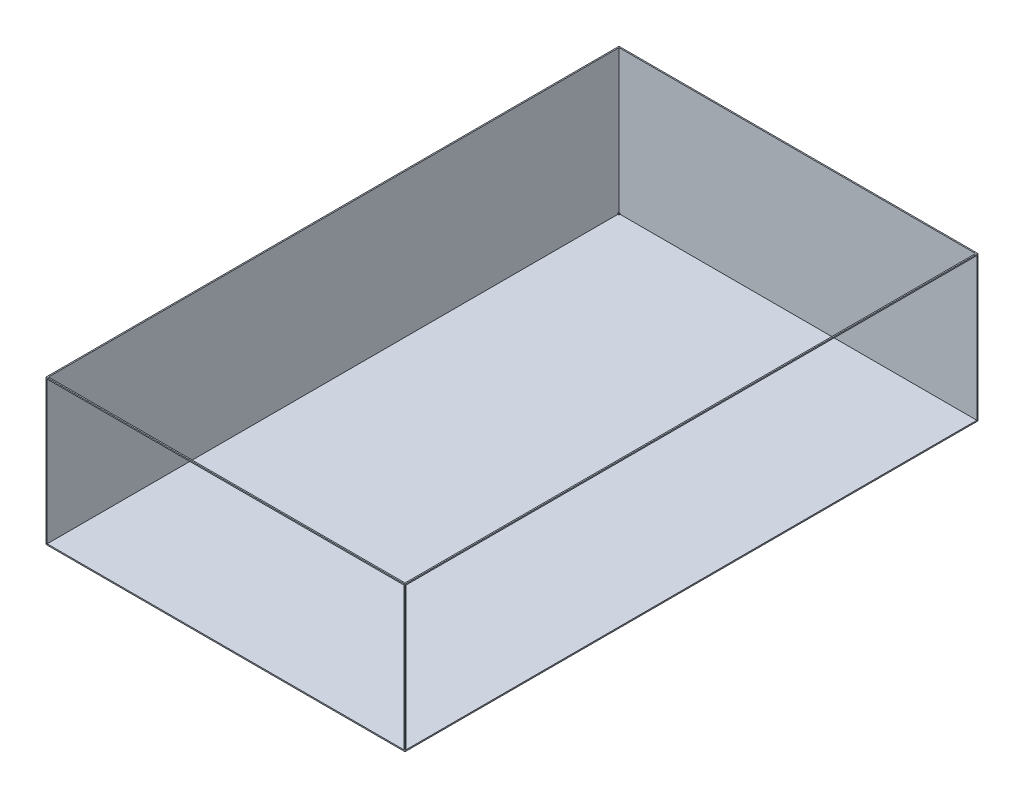
ISO-10303-21;
HEADER;
FILE_DESCRIPTION(('STEP AP214'),'2;1');
FILE_NAME('part.step','',(''),(''),'','','');
FILE_SCHEMA(('AUTOMOTIVE_DESIGN { 1 0 10303 214 1 1 1 1 }'));
ENDSEC;
DATA;
#1=APPLICATION_CONTEXT('core data for automotive mechanical design processes');
#2=APPLICATION_PROTOCOL_DEFINITION('international standard','automotive_design',2000,#1);
#3=PRODUCT_CONTEXT('',#1,'mechanical');
#4=PRODUCT('Part','Part','',(#3));
#5=PRODUCT_RELATED_PRODUCT_CATEGORY('part','',(#4));
#6=PRODUCT_DEFINITION_FORMATION('','',#4);
#7=PRODUCT_DEFINITION_CONTEXT('part definition',#1,'design');
#8=PRODUCT_DEFINITION('design','',#6,#7);
#9=PRODUCT_DEFINITION_SHAPE('','',#8);
#10=(LENGTH_UNIT() NAMED_UNIT(*) SI_UNIT(.MILLI.,.METRE.));
#11=(NAMED_UNIT(*) PLANE_ANGLE_UNIT() SI_UNIT($,.RADIAN.));
#12=(NAMED_UNIT(*) SI_UNIT($,.STERADIAN.) SOLID_ANGLE_UNIT());
#13=UNCERTAINTY_MEASURE_WITH_UNIT(LENGTH_MEASURE(1.E-05),#10,'distance_accuracy_value','');
#14=(GEOMETRIC_REPRESENTATION_CONTEXT(3) GLOBAL_UNCERTAINTY_ASSIGNED_CONTEXT((#13)) GLOBAL_UNIT_ASSIGNED_CONTEXT((#10,
#11,#12)) REPRESENTATION_CONTEXT('',''));
#15=CARTESIAN_POINT('',(0.,0.,0.));
#16=DIRECTION('',(0.,0.,1.));
#17=DIRECTION('',(1.,0.,0.));
#18=AXIS2_PLACEMENT_3D('',#15,#16,#17);
#19=CARTESIAN_POINT('',(0.,0.,-120.));
#20=DIRECTION('',(0.,0.,1.));
#21=DIRECTION('',(1.,0.,0.));
#22=AXIS2_PLACEMENT_3D('',#19,#20,#21);
#23=PLANE('',#22);
#24=DIRECTION('',(1.,0.,0.));
#25=VECTOR('',#24,1.);
#26=CARTESIAN_POINT('',(0.,0.249999999999997,-120.));
#27=LINE('',#26,#25);
#28=CARTESIAN_POINT('',(0.24999999999999,0.249999999999997,-120.));
#29=VERTEX_POINT('',#28);
#30=CARTESIAN_POINT('',(0.499999999999987,0.25,-120.));
#31=VERTEX_POINT('',#30);
#32=EDGE_CURVE('E207',#29,#31,#27,.T.);
#33=ORIENTED_EDGE('',*,*,#32,.T.);
#34=DIRECTION('',(0.,1.,0.));
#35=VECTOR('',#34,1.);
#36=CARTESIAN_POINT('',(0.499999999999987,0.,-120.));
#37=LINE('',#36,#35);
#38=CARTESIAN_POINT('',(0.499999999999987,0.5,-120.));
#39=VERTEX_POINT('',#38);
#40=EDGE_CURVE('E147',#31,#39,#37,.T.);
#41=ORIENTED_EDGE('',*,*,#40,.T.);
#42=DIRECTION('',(-1.,0.,0.));
#43=VECTOR('',#42,1.);
#44=CARTESIAN_POINT('',(0.,0.5,-120.));
#45=LINE('',#44,#43);
#46=CARTESIAN_POINT('',(0.24999999999999,0.5,-120.));
#47=VERTEX_POINT('',#46);
#48=EDGE_CURVE('E255',#39,#47,#45,.T.);
#49=ORIENTED_EDGE('',*,*,#48,.T.);
#50=DIRECTION('',(0.,-1.,0.));
#51=VECTOR('',#50,1.);
#52=CARTESIAN_POINT('',(0.24999999999999,0.,-120.));
#53=LINE('',#52,#51);
#54=EDGE_CURVE('E205',#47,#29,#53,.T.);
#55=ORIENTED_EDGE('',*,*,#54,.T.);
#56=EDGE_LOOP('',(#33,#41,#49,#55));
#57=FACE_BOUND('',#56,.T.);
#58=ADVANCED_FACE('F36',(#57),#23,.T.);
#59=CARTESIAN_POINT('',(75.5,30.5,-120.5));
#60=DIRECTION('',(1.,0.,0.));
#61=DIRECTION('',(0.,1.,0.));
#62=AXIS2_PLACEMENT_3D('',#59,#60,#61);
#63=PLANE('',#62);
#64=DIRECTION('',(0.,1.,0.));
#65=VECTOR('',#64,1.);
#66=CARTESIAN_POINT('',(75.5,30.5,0.));
#67=LINE('',#66,#65);
#68=CARTESIAN_POINT('',(75.5,0.,0.));
#69=VERTEX_POINT('',#68);
#70=CARTESIAN_POINT('',(75.5,30.5,0.));
#71=VERTEX_POINT('',#70);
#72=EDGE_CURVE('E248',#69,#71,#67,.T.);
#73=ORIENTED_EDGE('',*,*,#72,.F.);
#74=DIRECTION('',(0.,0.,1.));
#75=VECTOR('',#74,1.);
#76=CARTESIAN_POINT('',(75.5,0.,-120.5));
#77=LINE('',#76,#75);
#78=CARTESIAN_POINT('',(75.5,0.,-120.5));
#79=VERTEX_POINT('',#78);
#80=EDGE_CURVE('E258',#79,#69,#77,.T.);
#81=ORIENTED_EDGE('',*,*,#80,.F.);
#82=DIRECTION('',(0.,1.,0.));
#83=VECTOR('',#82,1.);
#84=CARTESIAN_POINT('',(75.5,30.5,-120.5));
#85=LINE('',#84,#83);
#86=CARTESIAN_POINT('',(75.5,30.5,-120.5));
#87=VERTEX_POINT('',#86);
#88=EDGE_CURVE('E236',#79,#87,#85,.T.);
#89=ORIENTED_EDGE('',*,*,#88,.T.);
#90=DIRECTION('',(0.,0.,1.));
#91=VECTOR('',#90,1.);
#92=CARTESIAN_POINT('',(75.5,30.5,-120.5));
#93=LINE('',#92,#91);
#94=EDGE_CURVE('E256',#87,#71,#93,.T.);
#95=ORIENTED_EDGE('',*,*,#94,.T.);
#96=EDGE_LOOP('',(#73,#81,#89,#95));
#97=FACE_BOUND('',#96,.T.);
#98=DIRECTION('',(0.,0.,-1.));
#99=VECTOR('',#98,1.);
#100=CARTESIAN_POINT('',(75.5,30.25,0.));
#101=LINE('',#100,#99);
#102=CARTESIAN_POINT('',(75.5,30.25,-0.25));
#103=VERTEX_POINT('',#102);
#104=CARTESIAN_POINT('',(75.5,30.25,-120.25));
#105=VERTEX_POINT('',#104);
#106=EDGE_CURVE('E299',#103,#105,#101,.T.);
#107=ORIENTED_EDGE('',*,*,#106,.T.);
#108=DIRECTION('',(0.,-1.,0.));
#109=VECTOR('',#108,1.);
#110=CARTESIAN_POINT('',(75.5,0.,-120.25));
#111=LINE('',#110,#109);
#112=CARTESIAN_POINT('',(75.5,0.249999999999966,-120.25));
#113=VERTEX_POINT('',#112);
#114=EDGE_CURVE('E51',#105,#113,#111,.T.);
#115=ORIENTED_EDGE('',*,*,#114,.T.);
#116=DIRECTION('',(0.,0.,-1.));
#117=VECTOR('',#116,1.);
#118=CARTESIAN_POINT('',(75.5,0.249999999999966,0.));
#119=LINE('',#118,#117);
#120=CARTESIAN_POINT('',(75.5,0.249999999999966,-0.250000000000005));
#121=VERTEX_POINT('',#120);
#122=EDGE_CURVE('E160',#121,#113,#119,.T.);
#123=ORIENTED_EDGE('',*,*,#122,.F.);
#124=DIRECTION('',(0.,-1.,0.));
#125=VECTOR('',#124,1.);
#126=CARTESIAN_POINT('',(75.5,0.,-0.250000000000005));
#127=LINE('',#126,#125);
#128=EDGE_CURVE('E304',#103,#121,#127,.T.);
#129=ORIENTED_EDGE('',*,*,#128,.F.);
#130=EDGE_LOOP('',(#107,#115,#123,#129));
#131=FACE_BOUND('',#130,.T.);
#132=ADVANCED_FACE('F321',(#97,#131),#63,.T.);
#133=CARTESIAN_POINT('',(75.25,0.,-120.));
#134=DIRECTION('',(-1.,0.,0.));
#135=DIRECTION('',(0.,0.,1.));
#136=AXIS2_PLACEMENT_3D('',#133,#134,#135);
#137=PLANE('',#136);
#138=DIRECTION('',(0.,1.,0.));
#139=VECTOR('',#138,1.);
#140=CARTESIAN_POINT('',(75.25,0.5,-120.25));
#141=LINE('',#140,#139);
#142=CARTESIAN_POINT('',(75.25,30.25,-120.25));
#143=VERTEX_POINT('',#142);
#144=CARTESIAN_POINT('',(75.25,30.5,-120.25));
#145=VERTEX_POINT('',#144);
#146=EDGE_CURVE('E186',#143,#145,#141,.T.);
#147=ORIENTED_EDGE('',*,*,#146,.F.);
#148=DIRECTION('',(0.,0.,1.));
#149=VECTOR('',#148,1.);
#150=CARTESIAN_POINT('',(75.25,30.25,-120.));
#151=LINE('',#150,#149);
#152=CARTESIAN_POINT('',(75.25,30.25,-0.25));
#153=VERTEX_POINT('',#152);
#154=EDGE_CURVE('E167',#143,#153,#151,.T.);
#155=ORIENTED_EDGE('',*,*,#154,.T.);
#156=DIRECTION('',(0.,1.,0.));
#157=VECTOR('',#156,1.);
#158=CARTESIAN_POINT('',(75.25,0.5,-0.25));
#159=LINE('',#158,#157);
#160=CARTESIAN_POINT('',(75.25,30.5,-0.25));
#161=VERTEX_POINT('',#160);
#162=EDGE_CURVE('E197',#153,#161,#159,.T.);
#163=ORIENTED_EDGE('',*,*,#162,.T.);
#164=DIRECTION('',(0.,0.,1.));
#165=VECTOR('',#164,1.);
#166=CARTESIAN_POINT('',(75.25,30.5,0.));
#167=LINE('',#166,#165);
#168=EDGE_CURVE('E180',#145,#161,#167,.T.);
#169=ORIENTED_EDGE('',*,*,#168,.F.);
#170=EDGE_LOOP('',(#147,#155,#163,#169));
#171=FACE_BOUND('',#170,.T.);
#172=ADVANCED_FACE('F293',(#171),#137,.T.);
#173=CARTESIAN_POINT('',(0.,0.5,0.));
#174=DIRECTION('',(0.,1.,0.));
#175=DIRECTION('',(0.,0.,1.));
#176=AXIS2_PLACEMENT_3D('',#173,#174,#175);
#177=PLANE('',#176);
#178=ORIENTED_EDGE('',*,*,#48,.F.);
#179=DIRECTION('',(0.,0.,-1.));
#180=VECTOR('',#179,1.);
#181=CARTESIAN_POINT('',(0.499999999999987,0.5,0.));
#182=LINE('',#181,#180);
#183=CARTESIAN_POINT('',(0.499999999999987,0.5,-120.25));
#184=VERTEX_POINT('',#183);
#185=EDGE_CURVE('E11',#39,#184,#182,.T.);
#186=ORIENTED_EDGE('',*,*,#185,.T.);
#187=DIRECTION('',(1.,0.,0.));
#188=VECTOR('',#187,1.);
#189=CARTESIAN_POINT('',(0.,0.5,-120.25));
#190=LINE('',#189,#188);
#191=CARTESIAN_POINT('',(0.249999999999991,0.5,-120.25));
#192=VERTEX_POINT('',#191);
#193=EDGE_CURVE('E159',#192,#184,#190,.T.);
#194=ORIENTED_EDGE('',*,*,#193,.F.);
#195=DIRECTION('',(0.,0.,1.));
#196=VECTOR('',#195,1.);
#197=CARTESIAN_POINT('',(0.250000000000005,0.5,0.));
#198=LINE('',#197,#196);
#199=EDGE_CURVE('E182',#192,#47,#198,.T.);
#200=ORIENTED_EDGE('',*,*,#199,.T.);
#201=EDGE_LOOP('',(#178,#186,#194,#200));
#202=FACE_BOUND('',#201,.T.);
#203=ADVANCED_FACE('F286',(#202),#177,.T.);
#204=CARTESIAN_POINT('',(0.,30.5,-120.5));
#205=DIRECTION('',(0.,1.,0.));
#206=DIRECTION('',(0.,0.,1.));
#207=AXIS2_PLACEMENT_3D('',#204,#205,#206);
#208=PLANE('',#207);
#209=DIRECTION('',(-1.,0.,0.));
#210=VECTOR('',#209,1.);
#211=CARTESIAN_POINT('',(0.,30.5,0.));
#212=LINE('',#211,#210);
#213=CARTESIAN_POINT('',(0.,30.5,0.));
#214=VERTEX_POINT('',#213);
#215=EDGE_CURVE('E233',#71,#214,#212,.T.);
#216=ORIENTED_EDGE('',*,*,#215,.F.);
#217=ORIENTED_EDGE('',*,*,#94,.F.);
#218=DIRECTION('',(-1.,0.,0.));
#219=VECTOR('',#218,1.);
#220=CARTESIAN_POINT('',(0.,30.5,-120.5));
#221=LINE('',#220,#219);
#222=CARTESIAN_POINT('',(0.,30.5,-120.5));
#223=VERTEX_POINT('',#222);
#224=EDGE_CURVE('E239',#87,#223,#221,.T.);
#225=ORIENTED_EDGE('',*,*,#224,.T.);
#226=DIRECTION('',(0.,0.,1.));
#227=VECTOR('',#226,1.);
#228=CARTESIAN_POINT('',(0.,30.5,-120.5));
#229=LINE('',#228,#227);
#230=EDGE_CURVE('E253',#223,#214,#229,.T.);
#231=ORIENTED_EDGE('',*,*,#230,.T.);
#232=EDGE_LOOP('',(#216,#217,#225,#231));
#233=FACE_BOUND('',#232,.T.);
#234=DIRECTION('',(1.,0.,0.));
#235=VECTOR('',#234,1.);
#236=CARTESIAN_POINT('',(0.,30.5,-120.25));
#237=LINE('',#236,#235);
#238=CARTESIAN_POINT('',(0.249999999999991,30.5,-120.25));
#239=VERTEX_POINT('',#238);
#240=EDGE_CURVE('E189',#239,#145,#237,.T.);
#241=ORIENTED_EDGE('',*,*,#240,.T.);
#242=ORIENTED_EDGE('',*,*,#168,.T.);
#243=DIRECTION('',(1.,0.,0.));
#244=VECTOR('',#243,1.);
#245=CARTESIAN_POINT('',(0.,30.5,-0.25));
#246=LINE('',#245,#244);
#247=CARTESIAN_POINT('',(0.250000000000005,30.5,-0.25));
#248=VERTEX_POINT('',#247);
#249=EDGE_CURVE('E183',#248,#161,#246,.T.);
#250=ORIENTED_EDGE('',*,*,#249,.F.);
#251=DIRECTION('',(0.,0.,1.));
#252=VECTOR('',#251,1.);
#253=CARTESIAN_POINT('',(0.250000000000005,30.5,0.));
#254=LINE('',#253,#252);
#255=EDGE_CURVE('E192',#239,#248,#254,.T.);
#256=ORIENTED_EDGE('',*,*,#255,.F.);
#257=EDGE_LOOP('',(#241,#242,#250,#256));
#258=FACE_BOUND('',#257,.T.);
#259=ADVANCED_FACE('F291',(#233,#258),#208,.T.);
#260=CARTESIAN_POINT('',(0.,0.,0.));
#261=DIRECTION('',(0.,0.,1.));
#262=DIRECTION('',(1.,0.,0.));
#263=AXIS2_PLACEMENT_3D('',#260,#261,#262);
#264=PLANE('',#263);
#265=DIRECTION('',(0.,-1.,0.));
#266=VECTOR('',#265,1.);
#267=CARTESIAN_POINT('',(0.,30.5,0.));
#268=LINE('',#267,#266);
#269=CARTESIAN_POINT('',(0.,0.,0.));
#270=VERTEX_POINT('',#269);
#271=EDGE_CURVE('E223',#214,#270,#268,.T.);
#272=ORIENTED_EDGE('',*,*,#271,.T.);
#273=DIRECTION('',(1.,0.,0.));
#274=VECTOR('',#273,1.);
#275=CARTESIAN_POINT('',(0.,0.,0.));
#276=LINE('',#275,#274);
#277=EDGE_CURVE('E245',#270,#69,#276,.T.);
#278=ORIENTED_EDGE('',*,*,#277,.T.);
#279=ORIENTED_EDGE('',*,*,#72,.T.);
#280=ORIENTED_EDGE('',*,*,#215,.T.);
#281=EDGE_LOOP('',(#272,#278,#279,#280));
#282=FACE_BOUND('',#281,.T.);
#283=DIRECTION('',(1.,0.,0.));
#284=VECTOR('',#283,1.);
#285=CARTESIAN_POINT('',(0.,30.25,0.));
#286=LINE('',#285,#284);
#287=CARTESIAN_POINT('',(0.249999999999986,30.25,0.));
#288=VERTEX_POINT('',#287);
#289=CARTESIAN_POINT('',(75.25,30.25,0.));
#290=VERTEX_POINT('',#289);
#291=EDGE_CURVE('E213',#288,#290,#286,.T.);
#292=ORIENTED_EDGE('',*,*,#291,.T.);
#293=DIRECTION('',(0.,-1.,0.));
#294=VECTOR('',#293,1.);
#295=CARTESIAN_POINT('',(75.25,0.,0.));
#296=LINE('',#295,#294);
#297=CARTESIAN_POINT('',(75.25,0.249999999999997,0.));
#298=VERTEX_POINT('',#297);
#299=EDGE_CURVE('E199',#290,#298,#296,.T.);
#300=ORIENTED_EDGE('',*,*,#299,.T.);
#301=DIRECTION('',(1.,0.,0.));
#302=VECTOR('',#301,1.);
#303=CARTESIAN_POINT('',(0.,0.249999999999997,0.));
#304=LINE('',#303,#302);
#305=CARTESIAN_POINT('',(0.24999999999999,0.249999999999997,0.));
#306=VERTEX_POINT('',#305);
#307=EDGE_CURVE('E208',#306,#298,#304,.T.);
#308=ORIENTED_EDGE('',*,*,#307,.F.);
#309=DIRECTION('',(0.,-1.,0.));
#310=VECTOR('',#309,1.);
#311=CARTESIAN_POINT('',(0.24999999999999,0.,0.));
#312=LINE('',#311,#310);
#313=EDGE_CURVE('E216',#288,#306,#312,.T.);
#314=ORIENTED_EDGE('',*,*,#313,.F.);
#315=EDGE_LOOP('',(#292,#300,#308,#314));
#316=FACE_BOUND('',#315,.T.);
#317=ADVANCED_FACE('F279',(#282,#316),#264,.T.);
#318=CARTESIAN_POINT('',(0.,30.5,-120.5));
#319=DIRECTION('',(-1.,0.,0.));
#320=DIRECTION('',(0.,-1.,0.));
#321=AXIS2_PLACEMENT_3D('',#318,#319,#320);
#322=PLANE('',#321);
#323=ORIENTED_EDGE('',*,*,#271,.F.);
#324=ORIENTED_EDGE('',*,*,#230,.F.);
#325=DIRECTION('',(0.,-1.,0.));
#326=VECTOR('',#325,1.);
#327=CARTESIAN_POINT('',(0.,30.5,-120.5));
#328=LINE('',#327,#326);
#329=CARTESIAN_POINT('',(0.,0.,-120.5));
#330=VERTEX_POINT('',#329);
#331=EDGE_CURVE('E229',#223,#330,#328,.T.);
#332=ORIENTED_EDGE('',*,*,#331,.T.);
#333=DIRECTION('',(0.,0.,1.));
#334=VECTOR('',#333,1.);
#335=CARTESIAN_POINT('',(0.,0.,-120.5));
#336=LINE('',#335,#334);
#337=EDGE_CURVE('E242',#330,#270,#336,.T.);
#338=ORIENTED_EDGE('',*,*,#337,.T.);
#339=EDGE_LOOP('',(#323,#324,#332,#338));
#340=FACE_BOUND('',#339,.T.);
#341=ADVANCED_FACE('F38',(#340),#322,.T.);
#342=CARTESIAN_POINT('',(0.,0.,-120.5));
#343=DIRECTION('',(0.,-1.,0.));
#344=DIRECTION('',(0.,0.,-1.));
#345=AXIS2_PLACEMENT_3D('',#342,#343,#344);
#346=PLANE('',#345);
#347=ORIENTED_EDGE('',*,*,#277,.F.);
#348=ORIENTED_EDGE('',*,*,#337,.F.);
#349=DIRECTION('',(1.,0.,0.));
#350=VECTOR('',#349,1.);
#351=CARTESIAN_POINT('',(0.,0.,-120.5));
#352=LINE('',#351,#350);
#353=EDGE_CURVE('E232',#330,#79,#352,.T.);
#354=ORIENTED_EDGE('',*,*,#353,.T.);
#355=ORIENTED_EDGE('',*,*,#80,.T.);
#356=EDGE_LOOP('',(#347,#348,#354,#355));
#357=FACE_BOUND('',#356,.T.);
#358=ADVANCED_FACE('F316',(#357),#346,.T.);
#359=CARTESIAN_POINT('',(0.,0.,-120.5));
#360=DIRECTION('',(0.,0.,1.));
#361=DIRECTION('',(1.,0.,0.));
#362=AXIS2_PLACEMENT_3D('',#359,#360,#361);
#363=PLANE('',#362);
#364=ORIENTED_EDGE('',*,*,#331,.F.);
#365=ORIENTED_EDGE('',*,*,#224,.F.);
#366=ORIENTED_EDGE('',*,*,#88,.F.);
#367=ORIENTED_EDGE('',*,*,#353,.F.);
#368=EDGE_LOOP('',(#364,#365,#366,#367));
#369=FACE_BOUND('',#368,.T.);
#370=ADVANCED_FACE('F309',(#369),#363,.F.);
#371=DIRECTION('',(0.,1.,0.));
#372=VECTOR('',#371,1.);
#373=CARTESIAN_POINT('',(75.25,0.,-0.25));
#374=LINE('',#373,#372);
#375=CARTESIAN_POINT('',(75.25,0.249999999999966,-0.250000000000005));
#376=VERTEX_POINT('',#375);
#377=EDGE_CURVE('E178',#376,#153,#374,.T.);
#378=ORIENTED_EDGE('',*,*,#377,.F.);
#379=DIRECTION('',(0.,0.,1.));
#380=VECTOR('',#379,1.);
#381=CARTESIAN_POINT('',(75.25,0.249999999999997,-120.));
#382=LINE('',#381,#380);
#383=EDGE_CURVE('E221',#376,#298,#382,.T.);
#384=ORIENTED_EDGE('',*,*,#383,.T.);
#385=ORIENTED_EDGE('',*,*,#299,.F.);
#386=DIRECTION('',(0.,0.,1.));
#387=VECTOR('',#386,1.);
#388=CARTESIAN_POINT('',(75.25,30.25,-120.));
#389=LINE('',#388,#387);
#390=EDGE_CURVE('E210',#153,#290,#389,.T.);
#391=ORIENTED_EDGE('',*,*,#390,.F.);
#392=EDGE_LOOP('',(#378,#384,#385,#391));
#393=FACE_BOUND('',#392,.T.);
#394=ADVANCED_FACE('F307',(#393),#137,.T.);
#395=CARTESIAN_POINT('',(0.,0.249999999999997,-120.));
#396=DIRECTION('',(0.,-1.,0.));
#397=DIRECTION('',(0.,0.,-1.));
#398=AXIS2_PLACEMENT_3D('',#395,#396,#397);
#399=PLANE('',#398);
#400=ORIENTED_EDGE('',*,*,#383,.F.);
#401=DIRECTION('',(1.,0.,0.));
#402=VECTOR('',#401,1.);
#403=CARTESIAN_POINT('',(0.499999999999987,0.25,-0.250000000000005));
#404=LINE('',#403,#402);
#405=EDGE_CURVE('E165',#376,#121,#404,.T.);
#406=ORIENTED_EDGE('',*,*,#405,.T.);
#407=ORIENTED_EDGE('',*,*,#122,.T.);
#408=DIRECTION('',(1.,0.,0.));
#409=VECTOR('',#408,1.);
#410=CARTESIAN_POINT('',(0.499999999999987,0.25,-120.25));
#411=LINE('',#410,#409);
#412=CARTESIAN_POINT('',(0.499999999999987,0.25,-120.25));
#413=VERTEX_POINT('',#412);
#414=EDGE_CURVE('E156',#413,#113,#411,.T.);
#415=ORIENTED_EDGE('',*,*,#414,.F.);
#416=DIRECTION('',(0.,0.,-1.));
#417=VECTOR('',#416,1.);
#418=CARTESIAN_POINT('',(0.499999999999987,0.25,0.));
#419=LINE('',#418,#417);
#420=EDGE_CURVE('E144',#31,#413,#419,.T.);
#421=ORIENTED_EDGE('',*,*,#420,.F.);
#422=ORIENTED_EDGE('',*,*,#32,.F.);
#423=DIRECTION('',(0.,0.,1.));
#424=VECTOR('',#423,1.);
#425=CARTESIAN_POINT('',(0.24999999999999,0.249999999999997,-120.));
#426=LINE('',#425,#424);
#427=EDGE_CURVE('E224',#29,#306,#426,.T.);
#428=ORIENTED_EDGE('',*,*,#427,.T.);
#429=ORIENTED_EDGE('',*,*,#307,.T.);
#430=EDGE_LOOP('',(#400,#406,#407,#415,#421,#422,#428,#429));
#431=FACE_BOUND('',#430,.T.);
#432=ADVANCED_FACE('F163',(#431),#399,.F.);
#433=CARTESIAN_POINT('',(0.24999999999999,0.,-120.));
#434=DIRECTION('',(-1.,0.,0.));
#435=DIRECTION('',(0.,-1.,0.));
#436=AXIS2_PLACEMENT_3D('',#433,#434,#435);
#437=PLANE('',#436);
#438=DIRECTION('',(0.,1.,0.));
#439=VECTOR('',#438,1.);
#440=CARTESIAN_POINT('',(0.250000000000005,0.5,-0.25));
#441=LINE('',#440,#439);
#442=CARTESIAN_POINT('',(0.250000000000005,30.25,-0.25));
#443=VERTEX_POINT('',#442);
#444=EDGE_CURVE('E200',#443,#248,#441,.T.);
#445=ORIENTED_EDGE('',*,*,#444,.F.);
#446=DIRECTION('',(0.,0.,1.));
#447=VECTOR('',#446,1.);
#448=CARTESIAN_POINT('',(0.249999999999986,30.25,-120.));
#449=LINE('',#448,#447);
#450=EDGE_CURVE('E226',#443,#288,#449,.T.);
#451=ORIENTED_EDGE('',*,*,#450,.T.);
#452=ORIENTED_EDGE('',*,*,#313,.T.);
#453=ORIENTED_EDGE('',*,*,#427,.F.);
#454=ORIENTED_EDGE('',*,*,#54,.F.);
#455=ORIENTED_EDGE('',*,*,#199,.F.);
#456=DIRECTION('',(0.,1.,0.));
#457=VECTOR('',#456,1.);
#458=CARTESIAN_POINT('',(0.249999999999991,0.5,-120.25));
#459=LINE('',#458,#457);
#460=EDGE_CURVE('E202',#192,#239,#459,.T.);
#461=ORIENTED_EDGE('',*,*,#460,.T.);
#462=ORIENTED_EDGE('',*,*,#255,.T.);
#463=EDGE_LOOP('',(#445,#451,#452,#453,#454,#455,#461,#462));
#464=FACE_BOUND('',#463,.T.);
#465=ADVANCED_FACE('F270',(#464),#437,.F.);
#466=CARTESIAN_POINT('',(0.,30.25,-120.));
#467=DIRECTION('',(0.,-1.,0.));
#468=DIRECTION('',(1.,0.,0.));
#469=AXIS2_PLACEMENT_3D('',#466,#467,#468);
#470=PLANE('',#469);
#471=DIRECTION('',(-1.,0.,0.));
#472=VECTOR('',#471,1.);
#473=CARTESIAN_POINT('',(0.,30.25,-0.25));
#474=LINE('',#473,#472);
#475=EDGE_CURVE('E44',#153,#443,#474,.T.);
#476=ORIENTED_EDGE('',*,*,#475,.F.);
#477=ORIENTED_EDGE('',*,*,#390,.T.);
#478=ORIENTED_EDGE('',*,*,#291,.F.);
#479=ORIENTED_EDGE('',*,*,#450,.F.);
#480=EDGE_LOOP('',(#476,#477,#478,#479));
#481=FACE_BOUND('',#480,.T.);
#482=ADVANCED_FACE('F274',(#481),#470,.T.);
#483=CARTESIAN_POINT('',(0.,0.5,-0.25));
#484=DIRECTION('',(0.,0.,1.));
#485=DIRECTION('',(1.,0.,0.));
#486=AXIS2_PLACEMENT_3D('',#483,#484,#485);
#487=PLANE('',#486);
#488=ORIENTED_EDGE('',*,*,#475,.T.);
#489=ORIENTED_EDGE('',*,*,#444,.T.);
#490=ORIENTED_EDGE('',*,*,#249,.T.);
#491=ORIENTED_EDGE('',*,*,#162,.F.);
#492=EDGE_LOOP('',(#488,#489,#490,#491));
#493=FACE_BOUND('',#492,.T.);
#494=ADVANCED_FACE('F265',(#493),#487,.F.);
#495=CARTESIAN_POINT('',(0.,0.5,-120.25));
#496=DIRECTION('',(0.,0.,1.));
#497=DIRECTION('',(1.,0.,0.));
#498=AXIS2_PLACEMENT_3D('',#495,#496,#497);
#499=PLANE('',#498);
#500=DIRECTION('',(1.,0.,0.));
#501=VECTOR('',#500,1.);
#502=CARTESIAN_POINT('',(0.5,30.25,-120.25));
#503=LINE('',#502,#501);
#504=EDGE_CURVE('E152',#143,#105,#503,.T.);
#505=ORIENTED_EDGE('',*,*,#504,.F.);
#506=ORIENTED_EDGE('',*,*,#146,.T.);
#507=ORIENTED_EDGE('',*,*,#240,.F.);
#508=ORIENTED_EDGE('',*,*,#460,.F.);
#509=ORIENTED_EDGE('',*,*,#193,.T.);
#510=DIRECTION('',(0.,-1.,0.));
#511=VECTOR('',#510,1.);
#512=CARTESIAN_POINT('',(0.499999999999987,0.,-120.25));
#513=LINE('',#512,#511);
#514=EDGE_CURVE('E59',#184,#413,#513,.T.);
#515=ORIENTED_EDGE('',*,*,#514,.T.);
#516=ORIENTED_EDGE('',*,*,#414,.T.);
#517=ORIENTED_EDGE('',*,*,#114,.F.);
#518=EDGE_LOOP('',(#505,#506,#507,#508,#509,#515,#516,#517));
#519=FACE_BOUND('',#518,.T.);
#520=ADVANCED_FACE('F155',(#519),#499,.T.);
#521=CARTESIAN_POINT('',(0.499999999999987,0.,-0.250000000000005));
#522=DIRECTION('',(0.,0.,1.));
#523=DIRECTION('',(0.,-1.,0.));
#524=AXIS2_PLACEMENT_3D('',#521,#522,#523);
#525=PLANE('',#524);
#526=ORIENTED_EDGE('',*,*,#377,.T.);
#527=DIRECTION('',(1.,0.,0.));
#528=VECTOR('',#527,1.);
#529=CARTESIAN_POINT('',(0.5,30.25,-0.25));
#530=LINE('',#529,#528);
#531=EDGE_CURVE('E169',#153,#103,#530,.T.);
#532=ORIENTED_EDGE('',*,*,#531,.T.);
#533=ORIENTED_EDGE('',*,*,#128,.T.);
#534=ORIENTED_EDGE('',*,*,#405,.F.);
#535=EDGE_LOOP('',(#526,#532,#533,#534));
#536=FACE_BOUND('',#535,.T.);
#537=ADVANCED_FACE('F303',(#536),#525,.F.);
#538=CARTESIAN_POINT('',(0.5,30.25,0.));
#539=DIRECTION('',(0.,-1.,0.));
#540=DIRECTION('',(1.,0.,0.));
#541=AXIS2_PLACEMENT_3D('',#538,#539,#540);
#542=PLANE('',#541);
#543=ORIENTED_EDGE('',*,*,#504,.T.);
#544=ORIENTED_EDGE('',*,*,#106,.F.);
#545=ORIENTED_EDGE('',*,*,#531,.F.);
#546=ORIENTED_EDGE('',*,*,#154,.F.);
#547=EDGE_LOOP('',(#543,#544,#545,#546));
#548=FACE_BOUND('',#547,.T.);
#549=ADVANCED_FACE('F296',(#548),#542,.T.);
#550=CARTESIAN_POINT('',(0.499999999999987,0.,0.));
#551=DIRECTION('',(1.,0.,0.));
#552=DIRECTION('',(0.,1.,0.));
#553=AXIS2_PLACEMENT_3D('',#550,#551,#552);
#554=PLANE('',#553);
#555=ORIENTED_EDGE('',*,*,#420,.T.);
#556=ORIENTED_EDGE('',*,*,#514,.F.);
#557=ORIENTED_EDGE('',*,*,#185,.F.);
#558=ORIENTED_EDGE('',*,*,#40,.F.);
#559=EDGE_LOOP('',(#555,#556,#557,#558));
#560=FACE_BOUND('',#559,.T.);
#561=ADVANCED_FACE('F145',(#560),#554,.T.);
#562=CLOSED_SHELL('',(#58,#132,#172,#203,#259,#317,#341,#358,#370,#394,#432,#465,#482,#494,#520,
#537,#549,#561));
#563=MANIFOLD_SOLID_BREP('B2',#562);
#564=ADVANCED_BREP_SHAPE_REPRESENTATION('',(#18,#563),#14);
#565=SHAPE_DEFINITION_REPRESENTATION(#9,#564);
ENDSEC;
END-ISO-10303-21;
